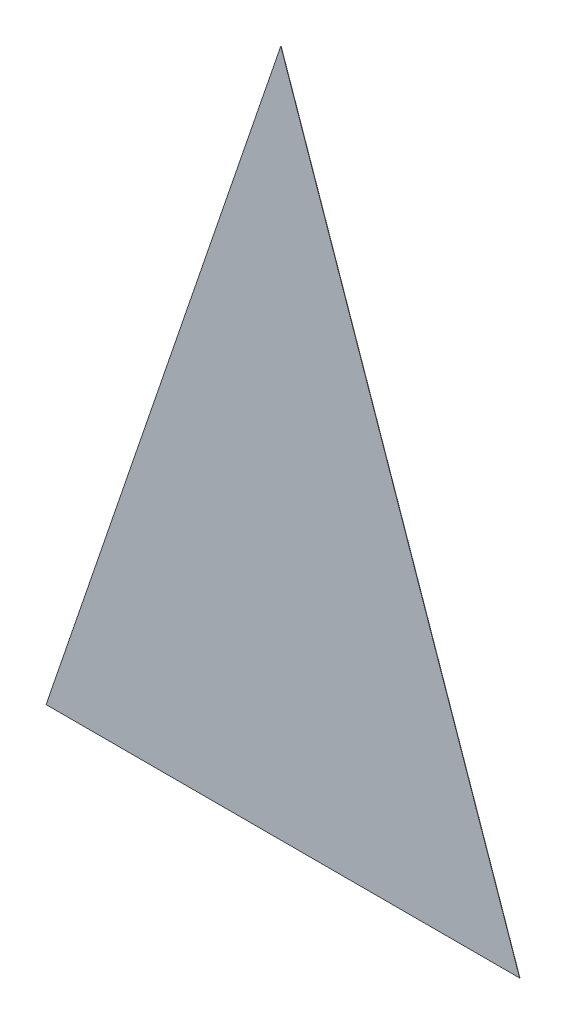
ISO-10303-21;
HEADER;
FILE_DESCRIPTION(('STEP AP214'),'2;1');
FILE_NAME('part.step','',(''),(''),'','','');
FILE_SCHEMA(('AUTOMOTIVE_DESIGN { 1 0 10303 214 1 1 1 1 }'));
ENDSEC;
DATA;
#1=APPLICATION_CONTEXT('core data for automotive mechanical design processes');
#2=APPLICATION_PROTOCOL_DEFINITION('international standard','automotive_design',2000,#1);
#3=PRODUCT_CONTEXT('',#1,'mechanical');
#4=PRODUCT('Part','Part','',(#3));
#5=PRODUCT_RELATED_PRODUCT_CATEGORY('part','',(#4));
#6=PRODUCT_DEFINITION_FORMATION('','',#4);
#7=PRODUCT_DEFINITION_CONTEXT('part definition',#1,'design');
#8=PRODUCT_DEFINITION('design','',#6,#7);
#9=PRODUCT_DEFINITION_SHAPE('','',#8);
#10=(LENGTH_UNIT() NAMED_UNIT(*) SI_UNIT(.MILLI.,.METRE.));
#11=(NAMED_UNIT(*) PLANE_ANGLE_UNIT() SI_UNIT($,.RADIAN.));
#12=(NAMED_UNIT(*) SI_UNIT($,.STERADIAN.) SOLID_ANGLE_UNIT());
#13=UNCERTAINTY_MEASURE_WITH_UNIT(LENGTH_MEASURE(1.E-05),#10,'distance_accuracy_value','');
#14=(GEOMETRIC_REPRESENTATION_CONTEXT(3) GLOBAL_UNCERTAINTY_ASSIGNED_CONTEXT((#13)) GLOBAL_UNIT_ASSIGNED_CONTEXT((#10,
#11,#12)) REPRESENTATION_CONTEXT('',''));
#15=CARTESIAN_POINT('',(0.,0.,0.));
#16=DIRECTION('',(0.,0.,1.));
#17=DIRECTION('',(1.,0.,0.));
#18=AXIS2_PLACEMENT_3D('',#15,#16,#17);
#19=CARTESIAN_POINT('',(118.06020527521,104.99481257268,23.488154875038));
#20=DIRECTION('',(0.,4.371138828674E-08,0.999999999999999));
#21=DIRECTION('',(0.,-0.999999999999999,4.371138828674E-08));
#22=AXIS2_PLACEMENT_3D('',#19,#20,#21);
#23=PLANE('',#22);
#24=DIRECTION('',(-0.999999999999996,-8.74227765734797E-08,0.));
#25=VECTOR('',#24,1.);
#26=CARTESIAN_POINT('',(119.69348981354,103.72350652599,23.488154930609));
#27=LINE('',#26,#25);
#28=CARTESIAN_POINT('',(118.03968736622,103.72350638141,23.488154878124));
#29=VERTEX_POINT('',#28);
#30=CARTESIAN_POINT('',(119.693489813538,103.72350652599,23.488154930609));
#31=VERTEX_POINT('',#30);
#32=EDGE_CURVE('E50',#29,#31,#27,.F.);
#33=ORIENTED_EDGE('',*,*,#32,.T.);
#34=DIRECTION('',(0.328093784152014,-0.944645154966039,0.));
#35=VECTOR('',#34,1.);
#36=CARTESIAN_POINT('',(118.85942852669,106.12492950814,23.488154930609));
#37=LINE('',#36,#35);
#38=CARTESIAN_POINT('',(118.859428526691,106.12492950814,23.488154878124));
#39=VERTEX_POINT('',#38);
#40=EDGE_CURVE('E48',#31,#39,#37,.F.);
#41=ORIENTED_EDGE('',*,*,#40,.T.);
#42=DIRECTION('',(0.323053153199965,0.946380821977897,0.));
#43=VECTOR('',#42,1.);
#44=CARTESIAN_POINT('',(118.03968736622,103.72350638141,23.488154825639));
#45=LINE('',#44,#43);
#46=EDGE_CURVE('E51',#39,#29,#45,.F.);
#47=ORIENTED_EDGE('',*,*,#46,.T.);
#48=EDGE_LOOP('',(#33,#41,#47));
#49=FACE_BOUND('',#48,.T.);
#50=ADVANCED_FACE('F17',(#49),#23,.T.);
#51=CARTESIAN_POINT('',(119.69348981354,103.72350652599,23.488154930609));
#52=DIRECTION('',(-8.74227765734796E-08,0.999999999999995,-4.37113882867398E-08));
#53=DIRECTION('',(-0.999999999999996,-8.74227765734797E-08,0.));
#54=AXIS2_PLACEMENT_3D('',#51,#52,#53);
#55=PLANE('',#54);
#56=DIRECTION('',(0.,4.37113882867396E-08,0.999999999999999));
#57=VECTOR('',#56,1.);
#58=CARTESIAN_POINT('',(119.69348981354,103.72350652599,23.488154930609));
#59=LINE('',#58,#57);
#60=CARTESIAN_POINT('',(119.693489838648,103.723506453658,23.4871549306086));
#61=VERTEX_POINT('',#60);
#62=EDGE_CURVE('E20',#61,#31,#59,.T.);
#63=ORIENTED_EDGE('',*,*,#62,.T.);
#64=ORIENTED_EDGE('',*,*,#32,.F.);
#65=DIRECTION('',(0.,4.37113882867396E-08,0.999999999999999));
#66=VECTOR('',#65,1.);
#67=CARTESIAN_POINT('',(118.03968736622,103.72350638141,23.488154930609));
#68=LINE('',#67,#66);
#69=CARTESIAN_POINT('',(118.03968736622,103.723506381368,23.4871549306086));
#70=VERTEX_POINT('',#69);
#71=EDGE_CURVE('E66',#29,#70,#68,.F.);
#72=ORIENTED_EDGE('',*,*,#71,.T.);
#73=DIRECTION('',(1.,0.,0.));
#74=VECTOR('',#73,1.);
#75=CARTESIAN_POINT('',(118.06020527521,103.72350638137,23.4871549306086));
#76=LINE('',#75,#74);
#77=EDGE_CURVE('E65',#70,#61,#76,.T.);
#78=ORIENTED_EDGE('',*,*,#77,.T.);
#79=EDGE_LOOP('',(#63,#64,#72,#78));
#80=FACE_BOUND('',#79,.T.);
#81=ADVANCED_FACE('F63',(#80),#55,.F.);
#82=CARTESIAN_POINT('',(118.85942852669,106.12492950814,23.488154825639));
#83=DIRECTION('',(-0.944645154966039,-0.328093784152014,1.43414311836806E-08));
#84=DIRECTION('',(0.328093784152014,-0.944645154966039,0.));
#85=AXIS2_PLACEMENT_3D('',#82,#83,#84);
#86=PLANE('',#85);
#87=DIRECTION('',(1.35475634829427E-08,4.70533442720946E-09,1.));
#88=VECTOR('',#87,1.);
#89=CARTESIAN_POINT('',(118.85942852669,106.12492950814,23.488154825639));
#90=LINE('',#89,#88);
#91=CARTESIAN_POINT('',(118.859428526684,106.124929508118,23.487154825639));
#92=VERTEX_POINT('',#91);
#93=EDGE_CURVE('E34',#92,#39,#90,.T.);
#94=ORIENTED_EDGE('',*,*,#93,.T.);
#95=ORIENTED_EDGE('',*,*,#40,.F.);
#96=ORIENTED_EDGE('',*,*,#62,.F.);
#97=DIRECTION('',(-0.328093784153642,0.944645154965472,-4.12917527832322E-08));
#98=VECTOR('',#97,1.);
#99=CARTESIAN_POINT('',(119.69348981354,103.72350652595,23.4871549306086));
#100=LINE('',#99,#98);
#101=EDGE_CURVE('E26',#61,#92,#100,.T.);
#102=ORIENTED_EDGE('',*,*,#101,.T.);
#103=EDGE_LOOP('',(#94,#95,#96,#102));
#104=FACE_BOUND('',#103,.T.);
#105=ADVANCED_FACE('F58',(#104),#86,.F.);
#106=CARTESIAN_POINT('',(118.03968736622,103.72350638141,23.488154930609));
#107=DIRECTION('',(0.946380821977897,-0.323053153199965,1.41211054332585E-08));
#108=DIRECTION('',(0.323053153199965,0.946380821977897,0.));
#109=AXIS2_PLACEMENT_3D('',#106,#107,#108);
#110=PLANE('',#109);
#111=ORIENTED_EDGE('',*,*,#71,.F.);
#112=ORIENTED_EDGE('',*,*,#46,.F.);
#113=ORIENTED_EDGE('',*,*,#93,.F.);
#114=DIRECTION('',(-0.323053153198945,-0.946380821978244,4.13676187103653E-08));
#115=VECTOR('',#114,1.);
#116=CARTESIAN_POINT('',(118.85942852669,106.1249295081,23.487154825639));
#117=LINE('',#116,#115);
#118=EDGE_CURVE('E11',#92,#70,#117,.T.);
#119=ORIENTED_EDGE('',*,*,#118,.T.);
#120=EDGE_LOOP('',(#111,#112,#113,#119));
#121=FACE_BOUND('',#120,.T.);
#122=ADVANCED_FACE('F73',(#121),#110,.F.);
#123=CARTESIAN_POINT('',(118.06020527521,104.99481257264,23.487154875038));
#124=DIRECTION('',(0.,4.371138828674E-08,0.999999999999999));
#125=DIRECTION('',(0.,-0.999999999999999,4.371138828674E-08));
#126=AXIS2_PLACEMENT_3D('',#123,#124,#125);
#127=PLANE('',#126);
#128=ORIENTED_EDGE('',*,*,#101,.F.);
#129=ORIENTED_EDGE('',*,*,#77,.F.);
#130=ORIENTED_EDGE('',*,*,#118,.F.);
#131=EDGE_LOOP('',(#128,#129,#130));
#132=FACE_BOUND('',#131,.T.);
#133=ADVANCED_FACE('F72',(#132),#127,.F.);
#134=CLOSED_SHELL('',(#50,#81,#105,#122,#133));
#135=MANIFOLD_SOLID_BREP('B1',#134);
#136=ADVANCED_BREP_SHAPE_REPRESENTATION('',(#18,#135),#14);
#137=SHAPE_DEFINITION_REPRESENTATION(#9,#136);
ENDSEC;
END-ISO-10303-21;
